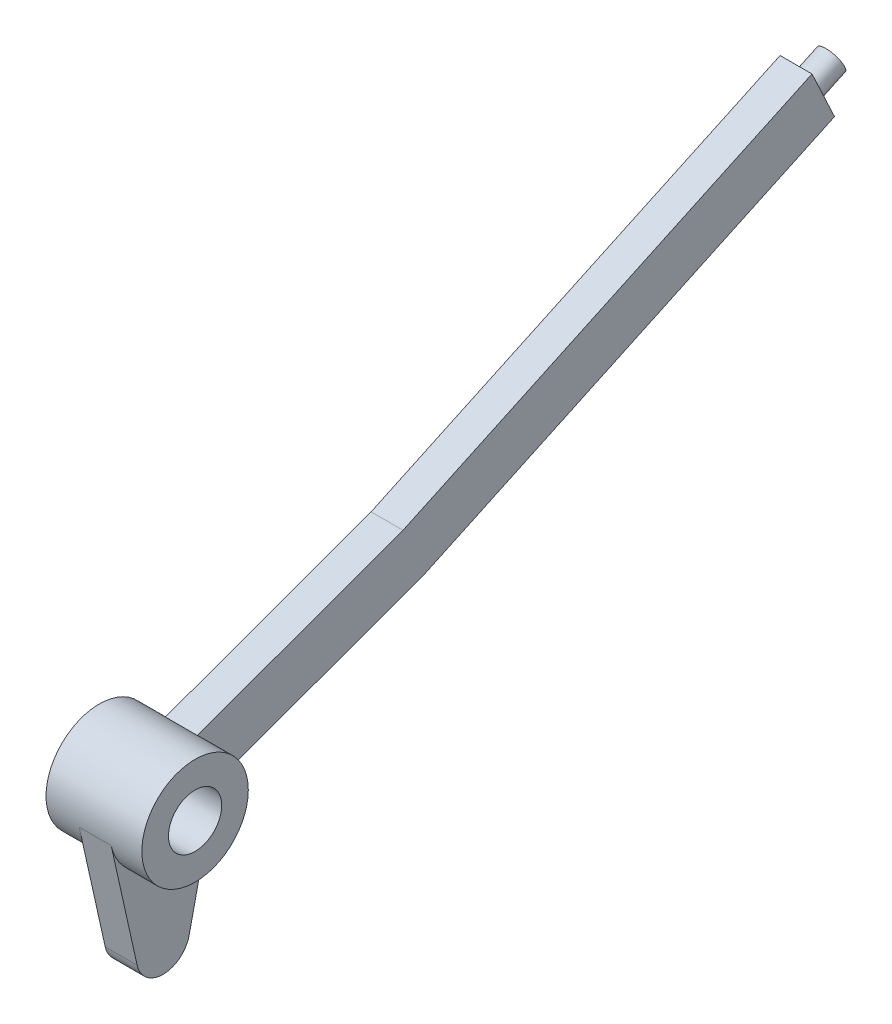
ISO-10303-21;
HEADER;
FILE_DESCRIPTION(('STEP AP214'),'2;1');
FILE_NAME('part.step','',(''),(''),'','','');
FILE_SCHEMA(('AUTOMOTIVE_DESIGN { 1 0 10303 214 1 1 1 1 }'));
ENDSEC;
DATA;
#1=APPLICATION_CONTEXT('core data for automotive mechanical design processes');
#2=APPLICATION_PROTOCOL_DEFINITION('international standard','automotive_design',2000,#1);
#3=PRODUCT_CONTEXT('',#1,'mechanical');
#4=PRODUCT('Part','Part','',(#3));
#5=PRODUCT_RELATED_PRODUCT_CATEGORY('part','',(#4));
#6=PRODUCT_DEFINITION_FORMATION('','',#4);
#7=PRODUCT_DEFINITION_CONTEXT('part definition',#1,'design');
#8=PRODUCT_DEFINITION('design','',#6,#7);
#9=PRODUCT_DEFINITION_SHAPE('','',#8);
#10=(LENGTH_UNIT() NAMED_UNIT(*) SI_UNIT(.MILLI.,.METRE.));
#11=(NAMED_UNIT(*) PLANE_ANGLE_UNIT() SI_UNIT($,.RADIAN.));
#12=(NAMED_UNIT(*) SI_UNIT($,.STERADIAN.) SOLID_ANGLE_UNIT());
#13=UNCERTAINTY_MEASURE_WITH_UNIT(LENGTH_MEASURE(1.E-05),#10,'distance_accuracy_value','');
#14=(GEOMETRIC_REPRESENTATION_CONTEXT(3) GLOBAL_UNCERTAINTY_ASSIGNED_CONTEXT((#13)) GLOBAL_UNIT_ASSIGNED_CONTEXT((#10,
#11,#12)) REPRESENTATION_CONTEXT('',''));
#15=CARTESIAN_POINT('',(0.,0.,0.));
#16=DIRECTION('',(0.,0.,1.));
#17=DIRECTION('',(1.,0.,0.));
#18=AXIS2_PLACEMENT_3D('',#15,#16,#17);
#19=CARTESIAN_POINT('',(3.,-2.17391304347826,-9.76084535680159));
#20=DIRECTION('',(0.,0.217391304347826,0.976084535680159));
#21=DIRECTION('',(0.,-0.976084535680159,0.217391304347826));
#22=AXIS2_PLACEMENT_3D('',#19,#20,#21);
#23=PLANE('',#22);
#24=DIRECTION('',(-1.,0.,0.));
#25=VECTOR('',#24,1.);
#26=CARTESIAN_POINT('',(3.,-4.40684254893768,-9.26353242952494));
#27=LINE('',#26,#25);
#28=CARTESIAN_POINT('',(3.,-4.40684254893768,-9.26353242952494));
#29=VERTEX_POINT('',#28);
#30=CARTESIAN_POINT('',(-3.,-4.40684254893768,-9.26353242952494));
#31=VERTEX_POINT('',#30);
#32=EDGE_CURVE('E159',#29,#31,#27,.T.);
#33=ORIENTED_EDGE('',*,*,#32,.F.);
#34=DIRECTION('',(0.,0.976084535680159,-0.217391304347826));
#35=VECTOR('',#34,1.);
#36=CARTESIAN_POINT('',(3.,-2.17391304347826,-9.76084535680159));
#37=LINE('',#36,#35);
#38=CARTESIAN_POINT('',(3.,-24.0869565217391,-4.88042267840079));
#39=VERTEX_POINT('',#38);
#40=EDGE_CURVE('E149',#39,#29,#37,.T.);
#41=ORIENTED_EDGE('',*,*,#40,.F.);
#42=DIRECTION('',(-1.,0.,0.));
#43=VECTOR('',#42,1.);
#44=CARTESIAN_POINT('',(3.,-24.0869565217391,-4.88042267840079));
#45=LINE('',#44,#43);
#46=CARTESIAN_POINT('',(-3.,-24.0869565217391,-4.88042267840079));
#47=VERTEX_POINT('',#46);
#48=EDGE_CURVE('E132',#39,#47,#45,.T.);
#49=ORIENTED_EDGE('',*,*,#48,.T.);
#50=DIRECTION('',(0.,0.976084535680159,-0.217391304347826));
#51=VECTOR('',#50,1.);
#52=CARTESIAN_POINT('',(-3.,-2.17391304347826,-9.76084535680159));
#53=LINE('',#52,#51);
#54=EDGE_CURVE('E156',#47,#31,#53,.T.);
#55=ORIENTED_EDGE('',*,*,#54,.T.);
#56=EDGE_LOOP('',(#33,#41,#49,#55));
#57=FACE_BOUND('',#56,.T.);
#58=ADVANCED_FACE('F41',(#57),#23,.F.);
#59=CARTESIAN_POINT('',(9.,0.,0.));
#60=DIRECTION('',(1.,0.,0.));
#61=DIRECTION('',(0.,0.,-1.));
#62=AXIS2_PLACEMENT_3D('',#59,#60,#61);
#63=PLANE('',#62);
#64=CARTESIAN_POINT('',(9.,0.,0.));
#65=DIRECTION('',(1.,0.,0.));
#66=DIRECTION('',(0.,0.,-1.));
#67=AXIS2_PLACEMENT_3D('',#64,#65,#66);
#68=CIRCLE('',#67,10.);
#69=CARTESIAN_POINT('',(9.,0.,-10.));
#70=VERTEX_POINT('',#69);
#71=EDGE_CURVE('E51',#70,#70,#68,.T.);
#72=ORIENTED_EDGE('',*,*,#71,.T.);
#73=EDGE_LOOP('',(#72));
#74=FACE_BOUND('',#73,.T.);
#75=CARTESIAN_POINT('',(9.,0.,0.));
#76=DIRECTION('',(1.,0.,0.));
#77=DIRECTION('',(0.,0.,-1.));
#78=AXIS2_PLACEMENT_3D('',#75,#76,#77);
#79=CIRCLE('',#78,5.);
#80=CARTESIAN_POINT('',(9.,0.,-5.));
#81=VERTEX_POINT('',#80);
#82=EDGE_CURVE('E224',#81,#81,#79,.T.);
#83=ORIENTED_EDGE('',*,*,#82,.F.);
#84=EDGE_LOOP('',(#83));
#85=FACE_BOUND('',#84,.T.);
#86=ADVANCED_FACE('F242',(#74,#85),#63,.T.);
#87=CARTESIAN_POINT('',(-9.,0.,0.));
#88=DIRECTION('',(1.,0.,0.));
#89=DIRECTION('',(0.,0.,-1.));
#90=AXIS2_PLACEMENT_3D('',#87,#88,#89);
#91=PLANE('',#90);
#92=CARTESIAN_POINT('',(-9.,0.,0.));
#93=DIRECTION('',(1.,0.,0.));
#94=DIRECTION('',(0.,0.,-1.));
#95=AXIS2_PLACEMENT_3D('',#92,#93,#94);
#96=CIRCLE('',#95,10.);
#97=CARTESIAN_POINT('',(-9.,0.,-10.));
#98=VERTEX_POINT('',#97);
#99=EDGE_CURVE('E45',#98,#98,#96,.T.);
#100=ORIENTED_EDGE('',*,*,#99,.F.);
#101=EDGE_LOOP('',(#100));
#102=FACE_BOUND('',#101,.T.);
#103=CARTESIAN_POINT('',(-9.,0.,0.));
#104=DIRECTION('',(1.,0.,0.));
#105=DIRECTION('',(0.,0.,-1.));
#106=AXIS2_PLACEMENT_3D('',#103,#104,#105);
#107=CIRCLE('',#106,5.);
#108=CARTESIAN_POINT('',(-9.,0.,-5.));
#109=VERTEX_POINT('',#108);
#110=EDGE_CURVE('E223',#109,#109,#107,.T.);
#111=ORIENTED_EDGE('',*,*,#110,.T.);
#112=EDGE_LOOP('',(#111));
#113=FACE_BOUND('',#112,.T.);
#114=ADVANCED_FACE('F239',(#102,#113),#91,.F.);
#115=CARTESIAN_POINT('',(9.,0.,0.));
#116=DIRECTION('',(-1.,0.,0.));
#117=DIRECTION('',(0.,0.,1.));
#118=AXIS2_PLACEMENT_3D('',#115,#116,#117);
#119=CYLINDRICAL_SURFACE('',#118,10.);
#120=DIRECTION('',(-1.,0.,0.));
#121=VECTOR('',#120,1.);
#122=CARTESIAN_POINT('',(3.,-2.17391304347826,9.76084535680159));
#123=LINE('',#122,#121);
#124=CARTESIAN_POINT('',(3.,-2.17391304347826,9.76084535680159));
#125=VERTEX_POINT('',#124);
#126=CARTESIAN_POINT('',(-3.,-2.17391304347826,9.76084535680159));
#127=VERTEX_POINT('',#126);
#128=EDGE_CURVE('E131',#125,#127,#123,.T.);
#129=ORIENTED_EDGE('',*,*,#128,.F.);
#130=CARTESIAN_POINT('',(3.,0.,0.));
#131=DIRECTION('',(-1.,0.,0.));
#132=DIRECTION('',(0.,0.,-1.));
#133=AXIS2_PLACEMENT_3D('',#130,#131,#132);
#134=CIRCLE('',#133,10.);
#135=CARTESIAN_POINT('',(3.,7.66044443118974,-6.42787609686544));
#136=VERTEX_POINT('',#135);
#137=EDGE_CURVE('E146',#136,#125,#134,.T.);
#138=ORIENTED_EDGE('',*,*,#137,.F.);
#139=DIRECTION('',(-1.,0.,0.));
#140=VECTOR('',#139,1.);
#141=CARTESIAN_POINT('',(3.,7.66044443118975,-6.42787609686544));
#142=LINE('',#141,#140);
#143=CARTESIAN_POINT('',(-3.,7.66044443118975,-6.42787609686544));
#144=VERTEX_POINT('',#143);
#145=EDGE_CURVE('E208',#136,#144,#142,.T.);
#146=ORIENTED_EDGE('',*,*,#145,.T.);
#147=CARTESIAN_POINT('',(-3.,0.,0.));
#148=DIRECTION('',(-1.,0.,0.));
#149=DIRECTION('',(0.,0.,-1.));
#150=AXIS2_PLACEMENT_3D('',#147,#148,#149);
#151=CIRCLE('',#150,10.);
#152=EDGE_CURVE('E200',#144,#127,#151,.T.);
#153=ORIENTED_EDGE('',*,*,#152,.T.);
#154=EDGE_LOOP('',(#129,#138,#146,#153));
#155=FACE_BOUND('',#154,.T.);
#156=ORIENTED_EDGE('',*,*,#71,.F.);
#157=EDGE_LOOP('',(#156));
#158=FACE_BOUND('',#157,.T.);
#159=ORIENTED_EDGE('',*,*,#99,.T.);
#160=EDGE_LOOP('',(#159));
#161=FACE_BOUND('',#160,.T.);
#162=ADVANCED_FACE('F43',(#155,#158,#161),#119,.T.);
#163=CARTESIAN_POINT('',(9.,0.,0.));
#164=DIRECTION('',(-1.,0.,0.));
#165=DIRECTION('',(0.,0.,1.));
#166=AXIS2_PLACEMENT_3D('',#163,#164,#165);
#167=CYLINDRICAL_SURFACE('',#166,5.);
#168=ORIENTED_EDGE('',*,*,#82,.T.);
#169=EDGE_LOOP('',(#168));
#170=FACE_BOUND('',#169,.T.);
#171=ORIENTED_EDGE('',*,*,#110,.F.);
#172=EDGE_LOOP('',(#171));
#173=FACE_BOUND('',#172,.T.);
#174=ADVANCED_FACE('F245',(#170,#173),#167,.F.);
#175=CARTESIAN_POINT('',(3.,12.4772086721101,-48.8998710852622));
#176=DIRECTION('',(0.,0.906307787036652,0.422618261740694));
#177=DIRECTION('',(0.,-0.422618261740694,0.906307787036652));
#178=AXIS2_PLACEMENT_3D('',#175,#176,#177);
#179=PLANE('',#178);
#180=DIRECTION('',(0.,0.422618261740694,-0.906307787036653));
#181=VECTOR('',#180,1.);
#182=CARTESIAN_POINT('',(-3.,12.4772086721101,-48.8998710852622));
#183=LINE('',#182,#181);
#184=CARTESIAN_POINT('',(-3.,12.4772086721101,-48.8998710852622));
#185=VERTEX_POINT('',#184);
#186=CARTESIAN_POINT('',(-3.,48.4920204790589,-126.133884246114));
#187=VERTEX_POINT('',#186);
#188=EDGE_CURVE('E168',#185,#187,#183,.T.);
#189=ORIENTED_EDGE('',*,*,#188,.T.);
#190=DIRECTION('',(-1.,0.,0.));
#191=VECTOR('',#190,1.);
#192=CARTESIAN_POINT('',(3.,48.4920204790589,-126.133884246114));
#193=LINE('',#192,#191);
#194=CARTESIAN_POINT('',(3.,48.4920204790589,-126.133884246114));
#195=VERTEX_POINT('',#194);
#196=EDGE_CURVE('E219',#195,#187,#193,.T.);
#197=ORIENTED_EDGE('',*,*,#196,.F.);
#198=DIRECTION('',(0.,0.422618261740694,-0.906307787036653));
#199=VECTOR('',#198,1.);
#200=CARTESIAN_POINT('',(3.,12.4772086721101,-48.8998710852622));
#201=LINE('',#200,#199);
#202=CARTESIAN_POINT('',(3.,12.4772086721101,-48.8998710852622));
#203=VERTEX_POINT('',#202);
#204=EDGE_CURVE('E169',#203,#195,#201,.T.);
#205=ORIENTED_EDGE('',*,*,#204,.F.);
#206=DIRECTION('',(-1.,0.,0.));
#207=VECTOR('',#206,1.);
#208=CARTESIAN_POINT('',(3.,12.4772086721101,-48.8998710852622));
#209=LINE('',#208,#207);
#210=EDGE_CURVE('E186',#203,#185,#209,.T.);
#211=ORIENTED_EDGE('',*,*,#210,.T.);
#212=EDGE_LOOP('',(#189,#197,#205,#211));
#213=FACE_BOUND('',#212,.T.);
#214=ADVANCED_FACE('F247',(#213),#179,.F.);
#215=CARTESIAN_POINT('',(3.,57.5550983494254,-121.907701628708));
#216=DIRECTION('',(0.,-0.422618261740695,0.906307787036652));
#217=DIRECTION('',(0.,-0.906307787036652,-0.422618261740695));
#218=AXIS2_PLACEMENT_3D('',#215,#216,#217);
#219=PLANE('',#218);
#220=CARTESIAN_POINT('',(0.,53.0235594142422,-124.020792937411));
#221=DIRECTION('',(0.,0.422618261740695,-0.906307787036652));
#222=DIRECTION('',(0.,0.906307787036652,0.422618261740695));
#223=AXIS2_PLACEMENT_3D('',#220,#221,#222);
#224=CIRCLE('',#223,2.5);
#225=CARTESIAN_POINT('',(0.,55.2893288818338,-122.964247283059));
#226=VERTEX_POINT('',#225);
#227=EDGE_CURVE('E11',#226,#226,#224,.T.);
#228=ORIENTED_EDGE('',*,*,#227,.F.);
#229=EDGE_LOOP('',(#228));
#230=FACE_BOUND('',#229,.T.);
#231=DIRECTION('',(0.,0.906307787036652,0.422618261740695));
#232=VECTOR('',#231,1.);
#233=CARTESIAN_POINT('',(-3.,57.5550983494254,-121.907701628708));
#234=LINE('',#233,#232);
#235=CARTESIAN_POINT('',(-3.,57.5550983494254,-121.907701628708));
#236=VERTEX_POINT('',#235);
#237=EDGE_CURVE('E190',#187,#236,#234,.T.);
#238=ORIENTED_EDGE('',*,*,#237,.T.);
#239=DIRECTION('',(-1.,0.,0.));
#240=VECTOR('',#239,1.);
#241=CARTESIAN_POINT('',(3.,57.5550983494254,-121.907701628708));
#242=LINE('',#241,#240);
#243=CARTESIAN_POINT('',(3.,57.5550983494254,-121.907701628708));
#244=VERTEX_POINT('',#243);
#245=EDGE_CURVE('E215',#244,#236,#242,.T.);
#246=ORIENTED_EDGE('',*,*,#245,.F.);
#247=DIRECTION('',(0.,0.906307787036652,0.422618261740695));
#248=VECTOR('',#247,1.);
#249=CARTESIAN_POINT('',(3.,57.5550983494254,-121.907701628708));
#250=LINE('',#249,#248);
#251=EDGE_CURVE('E172',#195,#244,#250,.T.);
#252=ORIENTED_EDGE('',*,*,#251,.F.);
#253=ORIENTED_EDGE('',*,*,#196,.T.);
#254=EDGE_LOOP('',(#238,#246,#252,#253));
#255=FACE_BOUND('',#254,.T.);
#256=ADVANCED_FACE('F254',(#230,#255),#219,.F.);
#257=CARTESIAN_POINT('',(3.,21.7248056604562,-45.0693909933288));
#258=DIRECTION('',(0.,-0.906307787036652,-0.422618261740694));
#259=DIRECTION('',(0.,0.422618261740694,-0.906307787036653));
#260=AXIS2_PLACEMENT_3D('',#257,#258,#259);
#261=PLANE('',#260);
#262=DIRECTION('',(0.,-0.422618261740694,0.906307787036653));
#263=VECTOR('',#262,1.);
#264=CARTESIAN_POINT('',(-3.,21.7248056604562,-45.0693909933288));
#265=LINE('',#264,#263);
#266=CARTESIAN_POINT('',(-3.,21.7248056604562,-45.0693909933288));
#267=VERTEX_POINT('',#266);
#268=EDGE_CURVE('E193',#236,#267,#265,.T.);
#269=ORIENTED_EDGE('',*,*,#268,.T.);
#270=DIRECTION('',(-1.,0.,0.));
#271=VECTOR('',#270,1.);
#272=CARTESIAN_POINT('',(3.,21.7248056604562,-45.0693909933288));
#273=LINE('',#272,#271);
#274=CARTESIAN_POINT('',(3.,21.7248056604562,-45.0693909933288));
#275=VERTEX_POINT('',#274);
#276=EDGE_CURVE('E211',#275,#267,#273,.T.);
#277=ORIENTED_EDGE('',*,*,#276,.F.);
#278=DIRECTION('',(0.,-0.422618261740694,0.906307787036653));
#279=VECTOR('',#278,1.);
#280=CARTESIAN_POINT('',(3.,21.7248056604562,-45.0693909933288));
#281=LINE('',#280,#279);
#282=EDGE_CURVE('E176',#244,#275,#281,.T.);
#283=ORIENTED_EDGE('',*,*,#282,.F.);
#284=ORIENTED_EDGE('',*,*,#245,.T.);
#285=EDGE_LOOP('',(#269,#277,#283,#284));
#286=FACE_BOUND('',#285,.T.);
#287=ADVANCED_FACE('F280',(#286),#261,.F.);
#288=CARTESIAN_POINT('',(3.,7.66044443118974,-6.42787609686544));
#289=DIRECTION('',(0.,-0.93969262078591,-0.342020143325663));
#290=DIRECTION('',(0.,0.342020143325663,-0.93969262078591));
#291=AXIS2_PLACEMENT_3D('',#288,#289,#290);
#292=PLANE('',#291);
#293=DIRECTION('',(0.,-0.342020143325663,0.93969262078591));
#294=VECTOR('',#293,1.);
#295=CARTESIAN_POINT('',(-3.,7.66044443118974,-6.42787609686544));
#296=LINE('',#295,#294);
#297=EDGE_CURVE('E196',#267,#144,#296,.T.);
#298=ORIENTED_EDGE('',*,*,#297,.T.);
#299=ORIENTED_EDGE('',*,*,#145,.F.);
#300=DIRECTION('',(0.,-0.342020143325663,0.93969262078591));
#301=VECTOR('',#300,1.);
#302=CARTESIAN_POINT('',(3.,7.66044443118974,-6.42787609686544));
#303=LINE('',#302,#301);
#304=EDGE_CURVE('E179',#275,#136,#303,.T.);
#305=ORIENTED_EDGE('',*,*,#304,.F.);
#306=ORIENTED_EDGE('',*,*,#276,.T.);
#307=EDGE_LOOP('',(#298,#299,#305,#306));
#308=FACE_BOUND('',#307,.T.);
#309=ADVANCED_FACE('F277',(#308),#292,.F.);
#310=CARTESIAN_POINT('',(3.,-1.73648177666936,-9.84807753012207));
#311=DIRECTION('',(0.,0.93969262078591,0.342020143325663));
#312=DIRECTION('',(0.,-0.342020143325663,0.93969262078591));
#313=AXIS2_PLACEMENT_3D('',#310,#311,#312);
#314=PLANE('',#313);
#315=DIRECTION('',(0.,0.342020143325663,-0.93969262078591));
#316=VECTOR('',#315,1.);
#317=CARTESIAN_POINT('',(3.,-1.73648177666936,-9.84807753012207));
#318=LINE('',#317,#316);
#319=CARTESIAN_POINT('',(3.,-0.795335966747261,-12.4338543912974));
#320=VERTEX_POINT('',#319);
#321=EDGE_CURVE('E59',#320,#203,#318,.T.);
#322=ORIENTED_EDGE('',*,*,#321,.F.);
#323=DIRECTION('',(-1.,0.,0.));
#324=VECTOR('',#323,1.);
#325=CARTESIAN_POINT('',(3.,-0.795335966747259,-12.4338543912974));
#326=LINE('',#325,#324);
#327=CARTESIAN_POINT('',(-3.,-0.795335966747261,-12.4338543912974));
#328=VERTEX_POINT('',#327);
#329=EDGE_CURVE('E64',#320,#328,#326,.T.);
#330=ORIENTED_EDGE('',*,*,#329,.T.);
#331=DIRECTION('',(0.,0.342020143325663,-0.93969262078591));
#332=VECTOR('',#331,1.);
#333=CARTESIAN_POINT('',(-3.,-1.73648177666936,-9.84807753012207));
#334=LINE('',#333,#332);
#335=EDGE_CURVE('E173',#328,#185,#334,.T.);
#336=ORIENTED_EDGE('',*,*,#335,.T.);
#337=ORIENTED_EDGE('',*,*,#210,.F.);
#338=EDGE_LOOP('',(#322,#330,#336,#337));
#339=FACE_BOUND('',#338,.T.);
#340=ADVANCED_FACE('F271',(#339),#314,.F.);
#341=CARTESIAN_POINT('',(3.,0.,0.));
#342=DIRECTION('',(1.,0.,0.));
#343=DIRECTION('',(0.,0.,-1.));
#344=AXIS2_PLACEMENT_3D('',#341,#342,#343);
#345=PLANE('',#344);
#346=ORIENTED_EDGE('',*,*,#204,.T.);
#347=ORIENTED_EDGE('',*,*,#251,.T.);
#348=ORIENTED_EDGE('',*,*,#282,.T.);
#349=ORIENTED_EDGE('',*,*,#304,.T.);
#350=ORIENTED_EDGE('',*,*,#137,.T.);
#351=DIRECTION('',(0.,0.976084535680159,0.217391304347826));
#352=VECTOR('',#351,1.);
#353=CARTESIAN_POINT('',(3.,-2.17391304347826,9.76084535680159));
#354=LINE('',#353,#352);
#355=CARTESIAN_POINT('',(3.,-24.0869565217391,4.88042267840079));
#356=VERTEX_POINT('',#355);
#357=EDGE_CURVE('E125',#356,#125,#354,.T.);
#358=ORIENTED_EDGE('',*,*,#357,.F.);
#359=CARTESIAN_POINT('',(3.,-23.,0.));
#360=DIRECTION('',(1.,0.,0.));
#361=DIRECTION('',(0.,0.,-1.));
#362=AXIS2_PLACEMENT_3D('',#359,#360,#361);
#363=CIRCLE('',#362,5.);
#364=EDGE_CURVE('E135',#356,#39,#363,.T.);
#365=ORIENTED_EDGE('',*,*,#364,.T.);
#366=ORIENTED_EDGE('',*,*,#40,.T.);
#367=CARTESIAN_POINT('',(3.,-5.49379907067681,-14.1439551079257));
#368=DIRECTION('',(1.,0.,0.));
#369=DIRECTION('',(0.,0.,-1.));
#370=AXIS2_PLACEMENT_3D('',#367,#368,#369);
#371=CIRCLE('',#370,5.);
#372=EDGE_CURVE('E313',#29,#320,#371,.F.);
#373=ORIENTED_EDGE('',*,*,#372,.T.);
#374=ORIENTED_EDGE('',*,*,#321,.T.);
#375=EDGE_LOOP('',(#346,#347,#348,#349,#350,#358,#365,#366,#373,#374));
#376=FACE_BOUND('',#375,.T.);
#377=ADVANCED_FACE('F144',(#376),#345,.T.);
#378=CARTESIAN_POINT('',(-3.,0.,0.));
#379=DIRECTION('',(1.,0.,0.));
#380=DIRECTION('',(0.,0.,-1.));
#381=AXIS2_PLACEMENT_3D('',#378,#379,#380);
#382=PLANE('',#381);
#383=ORIENTED_EDGE('',*,*,#188,.F.);
#384=ORIENTED_EDGE('',*,*,#335,.F.);
#385=CARTESIAN_POINT('',(-3.,-5.49379907067681,-14.1439551079257));
#386=DIRECTION('',(1.,0.,0.));
#387=DIRECTION('',(0.,0.,-1.));
#388=AXIS2_PLACEMENT_3D('',#385,#386,#387);
#389=CIRCLE('',#388,5.);
#390=EDGE_CURVE('E307',#31,#328,#389,.F.);
#391=ORIENTED_EDGE('',*,*,#390,.F.);
#392=ORIENTED_EDGE('',*,*,#54,.F.);
#393=CARTESIAN_POINT('',(-3.,-23.,0.));
#394=DIRECTION('',(1.,0.,0.));
#395=DIRECTION('',(0.,0.,-1.));
#396=AXIS2_PLACEMENT_3D('',#393,#394,#395);
#397=CIRCLE('',#396,5.);
#398=CARTESIAN_POINT('',(-3.,-24.0869565217391,4.88042267840079));
#399=VERTEX_POINT('',#398);
#400=EDGE_CURVE('E152',#399,#47,#397,.T.);
#401=ORIENTED_EDGE('',*,*,#400,.F.);
#402=DIRECTION('',(0.,0.976084535680159,0.217391304347826));
#403=VECTOR('',#402,1.);
#404=CARTESIAN_POINT('',(-3.,-2.17391304347826,9.76084535680159));
#405=LINE('',#404,#403);
#406=EDGE_CURVE('E127',#399,#127,#405,.T.);
#407=ORIENTED_EDGE('',*,*,#406,.T.);
#408=ORIENTED_EDGE('',*,*,#152,.F.);
#409=ORIENTED_EDGE('',*,*,#297,.F.);
#410=ORIENTED_EDGE('',*,*,#268,.F.);
#411=ORIENTED_EDGE('',*,*,#237,.F.);
#412=EDGE_LOOP('',(#383,#384,#391,#392,#401,#407,#408,#409,#410,#411));
#413=FACE_BOUND('',#412,.T.);
#414=ADVANCED_FACE('F270',(#413),#382,.F.);
#415=CARTESIAN_POINT('',(3.,-2.17391304347826,9.76084535680159));
#416=DIRECTION('',(0.,-0.217391304347826,0.976084535680159));
#417=DIRECTION('',(0.,-0.976084535680159,-0.217391304347826));
#418=AXIS2_PLACEMENT_3D('',#415,#416,#417);
#419=PLANE('',#418);
#420=ORIENTED_EDGE('',*,*,#406,.F.);
#421=DIRECTION('',(-1.,0.,0.));
#422=VECTOR('',#421,1.);
#423=CARTESIAN_POINT('',(3.,-24.0869565217391,4.88042267840079));
#424=LINE('',#423,#422);
#425=EDGE_CURVE('E120',#356,#399,#424,.T.);
#426=ORIENTED_EDGE('',*,*,#425,.F.);
#427=ORIENTED_EDGE('',*,*,#357,.T.);
#428=ORIENTED_EDGE('',*,*,#128,.T.);
#429=EDGE_LOOP('',(#420,#426,#427,#428));
#430=FACE_BOUND('',#429,.T.);
#431=ADVANCED_FACE('F122',(#430),#419,.T.);
#432=CARTESIAN_POINT('',(3.,-23.,0.));
#433=DIRECTION('',(-1.,0.,0.));
#434=DIRECTION('',(0.,0.,1.));
#435=AXIS2_PLACEMENT_3D('',#432,#433,#434);
#436=CYLINDRICAL_SURFACE('',#435,5.);
#437=ORIENTED_EDGE('',*,*,#400,.T.);
#438=ORIENTED_EDGE('',*,*,#48,.F.);
#439=ORIENTED_EDGE('',*,*,#364,.F.);
#440=ORIENTED_EDGE('',*,*,#425,.T.);
#441=EDGE_LOOP('',(#437,#438,#439,#440));
#442=FACE_BOUND('',#441,.T.);
#443=ADVANCED_FACE('F136',(#442),#436,.T.);
#444=CARTESIAN_POINT('',(3.,-5.49379907067681,-14.1439551079257));
#445=DIRECTION('',(-1.,0.,0.));
#446=DIRECTION('',(0.,0.,1.));
#447=AXIS2_PLACEMENT_3D('',#444,#445,#446);
#448=CYLINDRICAL_SURFACE('',#447,5.);
#449=ORIENTED_EDGE('',*,*,#390,.T.);
#450=ORIENTED_EDGE('',*,*,#329,.F.);
#451=ORIENTED_EDGE('',*,*,#372,.F.);
#452=ORIENTED_EDGE('',*,*,#32,.T.);
#453=EDGE_LOOP('',(#449,#450,#451,#452));
#454=FACE_BOUND('',#453,.T.);
#455=ADVANCED_FACE('F310',(#454),#448,.F.);
#456=CARTESIAN_POINT('',(0.,55.1366507229457,-128.552331872594));
#457=DIRECTION('',(0.,-0.422618261740695,0.906307787036652));
#458=DIRECTION('',(0.,-0.906307787036652,-0.422618261740695));
#459=AXIS2_PLACEMENT_3D('',#456,#457,#458);
#460=CYLINDRICAL_SURFACE('',#459,2.5);
#461=CARTESIAN_POINT('',(0.,55.1366507229457,-128.552331872594));
#462=DIRECTION('',(0.,0.422618261740695,-0.906307787036652));
#463=DIRECTION('',(0.,0.906307787036652,0.422618261740695));
#464=AXIS2_PLACEMENT_3D('',#461,#462,#463);
#465=CIRCLE('',#464,2.5);
#466=CARTESIAN_POINT('',(0.,57.4024201905373,-127.495786218243));
#467=VERTEX_POINT('',#466);
#468=EDGE_CURVE('E314',#467,#467,#465,.T.);
#469=ORIENTED_EDGE('',*,*,#468,.F.);
#470=EDGE_LOOP('',(#469));
#471=FACE_BOUND('',#470,.T.);
#472=ORIENTED_EDGE('',*,*,#227,.T.);
#473=EDGE_LOOP('',(#472));
#474=FACE_BOUND('',#473,.T.);
#475=ADVANCED_FACE('F328',(#471,#474),#460,.T.);
#476=CARTESIAN_POINT('',(0.,55.1366507229457,-128.552331872594));
#477=DIRECTION('',(0.,0.422618261740695,-0.906307787036652));
#478=DIRECTION('',(0.,0.906307787036652,0.422618261740695));
#479=AXIS2_PLACEMENT_3D('',#476,#477,#478);
#480=PLANE('',#479);
#481=ORIENTED_EDGE('',*,*,#468,.T.);
#482=EDGE_LOOP('',(#481));
#483=FACE_BOUND('',#482,.T.);
#484=ADVANCED_FACE('F326',(#483),#480,.T.);
#485=CLOSED_SHELL('',(#58,#86,#114,#162,#174,#214,#256,#287,#309,#340,#377,#414,#431,#443,#455,
#475,#484));
#486=MANIFOLD_SOLID_BREP('B2',#485);
#487=ADVANCED_BREP_SHAPE_REPRESENTATION('',(#18,#486),#14);
#488=SHAPE_DEFINITION_REPRESENTATION(#9,#487);
ENDSEC;
END-ISO-10303-21;
